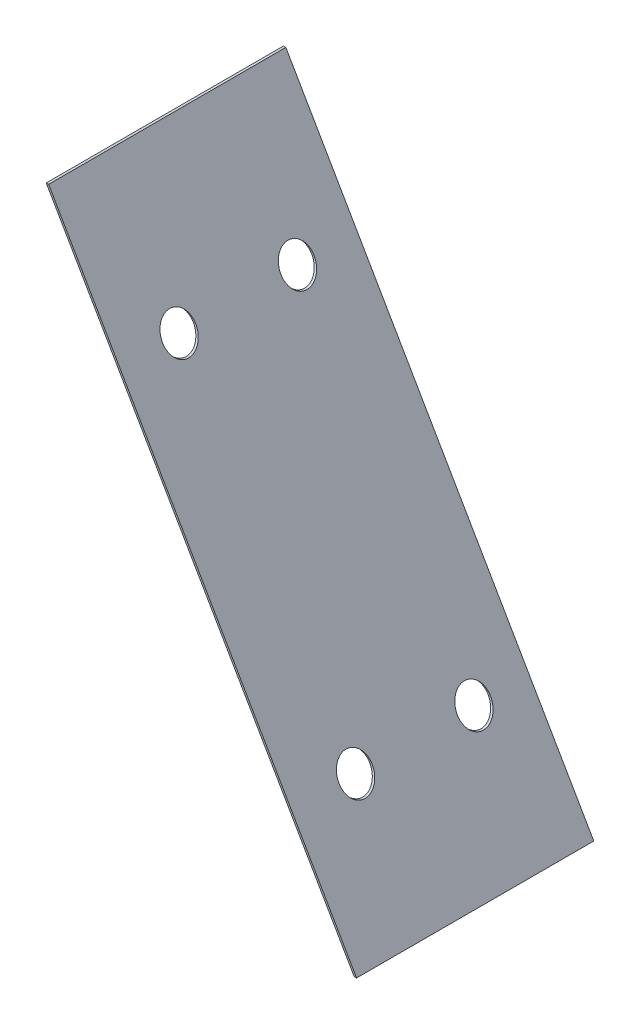
ISO-10303-21;
HEADER;
FILE_DESCRIPTION(('STEP AP214'),'2;1');
FILE_NAME('part.step','',(''),(''),'','','');
FILE_SCHEMA(('AUTOMOTIVE_DESIGN { 1 0 10303 214 1 1 1 1 }'));
ENDSEC;
DATA;
#1=APPLICATION_CONTEXT('core data for automotive mechanical design processes');
#2=APPLICATION_PROTOCOL_DEFINITION('international standard','automotive_design',2000,#1);
#3=PRODUCT_CONTEXT('',#1,'mechanical');
#4=PRODUCT('Part','Part','',(#3));
#5=PRODUCT_RELATED_PRODUCT_CATEGORY('part','',(#4));
#6=PRODUCT_DEFINITION_FORMATION('','',#4);
#7=PRODUCT_DEFINITION_CONTEXT('part definition',#1,'design');
#8=PRODUCT_DEFINITION('design','',#6,#7);
#9=PRODUCT_DEFINITION_SHAPE('','',#8);
#10=(LENGTH_UNIT() NAMED_UNIT(*) SI_UNIT(.MILLI.,.METRE.));
#11=(NAMED_UNIT(*) PLANE_ANGLE_UNIT() SI_UNIT($,.RADIAN.));
#12=(NAMED_UNIT(*) SI_UNIT($,.STERADIAN.) SOLID_ANGLE_UNIT());
#13=UNCERTAINTY_MEASURE_WITH_UNIT(LENGTH_MEASURE(1.E-05),#10,'distance_accuracy_value','');
#14=(GEOMETRIC_REPRESENTATION_CONTEXT(3) GLOBAL_UNCERTAINTY_ASSIGNED_CONTEXT((#13)) GLOBAL_UNIT_ASSIGNED_CONTEXT((#10,
#11,#12)) REPRESENTATION_CONTEXT('',''));
#15=CARTESIAN_POINT('',(0.,0.,0.));
#16=DIRECTION('',(0.,0.,1.));
#17=DIRECTION('',(1.,0.,0.));
#18=AXIS2_PLACEMENT_3D('',#15,#16,#17);
#19=CARTESIAN_POINT('',(32.5189335935961,-56.3244451920661,-90.2152556110115));
#20=DIRECTION('',(-0.866025403784436,-0.500000000000005,0.));
#21=DIRECTION('',(0.500000000000005,-0.866025403784436,0.));
#22=AXIS2_PLACEMENT_3D('',#19,#20,#21);
#23=PLANE('',#22);
#24=CARTESIAN_POINT('',(25.6628991469693,-44.4494451920663,-19.25));
#25=DIRECTION('',(-0.866025403784436,-0.500000000000005,0.));
#26=DIRECTION('',(0.500000000000005,-0.866025403784436,0.));
#27=AXIS2_PLACEMENT_3D('',#24,#25,#26);
#28=ELLIPSE('',#27,2.0207259421637,1.75);
#29=CARTESIAN_POINT('',(26.6732621180512,-46.1994451920663,-19.25));
#30=VERTEX_POINT('',#29);
#31=EDGE_CURVE('E116',#30,#30,#28,.T.);
#32=ORIENTED_EDGE('',*,*,#31,.F.);
#33=EDGE_LOOP('',(#32));
#34=FACE_BOUND('',#33,.T.);
#35=CARTESIAN_POINT('',(25.6628991469693,-44.4494451920663,-6.74999999999997));
#36=DIRECTION('',(-0.866025403784436,-0.500000000000005,0.));
#37=DIRECTION('',(0.500000000000005,-0.866025403784436,0.));
#38=AXIS2_PLACEMENT_3D('',#35,#36,#37);
#39=ELLIPSE('',#38,2.0207259421637,1.75);
#40=CARTESIAN_POINT('',(26.6732621180512,-46.1994451920663,-6.74999999999997));
#41=VERTEX_POINT('',#40);
#42=EDGE_CURVE('E113',#41,#41,#39,.T.);
#43=ORIENTED_EDGE('',*,*,#42,.F.);
#44=EDGE_LOOP('',(#43));
#45=FACE_BOUND('',#44,.T.);
#46=CARTESIAN_POINT('',(7.50555349946524,-13.,-6.27499999999999));
#47=DIRECTION('',(-0.866025403784436,-0.500000000000005,0.));
#48=DIRECTION('',(-0.500000000000005,0.866025403784436,0.));
#49=AXIS2_PLACEMENT_3D('',#46,#47,#48);
#50=ELLIPSE('',#49,2.0207259421637,1.75);
#51=CARTESIAN_POINT('',(6.49519052838338,-11.25,-6.27499999999999));
#52=VERTEX_POINT('',#51);
#53=EDGE_CURVE('E110',#52,#52,#50,.T.);
#54=ORIENTED_EDGE('',*,*,#53,.F.);
#55=EDGE_LOOP('',(#54));
#56=FACE_BOUND('',#55,.T.);
#57=CARTESIAN_POINT('',(7.50555349946525,-13.,-18.775));
#58=DIRECTION('',(-0.866025403784436,-0.500000000000005,0.));
#59=DIRECTION('',(-0.500000000000005,0.866025403784436,0.));
#60=AXIS2_PLACEMENT_3D('',#57,#58,#59);
#61=ELLIPSE('',#60,2.0207259421637,1.75);
#62=CARTESIAN_POINT('',(6.49519052838339,-11.25,-18.775));
#63=VERTEX_POINT('',#62);
#64=EDGE_CURVE('E92',#63,#63,#61,.T.);
#65=ORIENTED_EDGE('',*,*,#64,.F.);
#66=EDGE_LOOP('',(#65));
#67=FACE_BOUND('',#66,.T.);
#68=DIRECTION('',(-0.500000000000005,0.866025403784436,0.));
#69=VECTOR('',#68,1.);
#70=CARTESIAN_POINT('',(32.5189335935961,-56.3244451920661,-25.05));
#71=LINE('',#70,#69);
#72=CARTESIAN_POINT('',(32.5189335935961,-56.3244451920661,-25.05));
#73=VERTEX_POINT('',#72);
#74=CARTESIAN_POINT('',(0.,0.,-25.05));
#75=VERTEX_POINT('',#74);
#76=EDGE_CURVE('E41',#73,#75,#71,.T.);
#77=ORIENTED_EDGE('',*,*,#76,.F.);
#78=DIRECTION('',(0.,0.,1.));
#79=VECTOR('',#78,1.);
#80=CARTESIAN_POINT('',(32.5189335935961,-56.3244451920661,-90.2152556110115));
#81=LINE('',#80,#79);
#82=CARTESIAN_POINT('',(32.5189335935961,-56.3244451920661,0.));
#83=VERTEX_POINT('',#82);
#84=EDGE_CURVE('E70',#73,#83,#81,.T.);
#85=ORIENTED_EDGE('',*,*,#84,.T.);
#86=DIRECTION('',(0.500000000000005,-0.866025403784436,0.));
#87=VECTOR('',#86,1.);
#88=CARTESIAN_POINT('',(32.5189335935961,-56.3244451920661,0.));
#89=LINE('',#88,#87);
#90=CARTESIAN_POINT('',(0.,0.,0.));
#91=VERTEX_POINT('',#90);
#92=EDGE_CURVE('E74',#91,#83,#89,.T.);
#93=ORIENTED_EDGE('',*,*,#92,.F.);
#94=DIRECTION('',(0.,0.,1.));
#95=VECTOR('',#94,1.);
#96=CARTESIAN_POINT('',(0.,0.,-90.2152556110115));
#97=LINE('',#96,#95);
#98=EDGE_CURVE('E102',#75,#91,#97,.T.);
#99=ORIENTED_EDGE('',*,*,#98,.F.);
#100=EDGE_LOOP('',(#77,#85,#93,#99));
#101=FACE_BOUND('',#100,.T.);
#102=ADVANCED_FACE('F32',(#34,#45,#56,#67,#101),#23,.T.);
#103=CARTESIAN_POINT('',(0.,0.,-90.2152556110115));
#104=DIRECTION('',(0.,1.,0.));
#105=DIRECTION('',(-1.,0.,0.));
#106=AXIS2_PLACEMENT_3D('',#103,#104,#105);
#107=PLANE('',#106);
#108=DIRECTION('',(1.,0.,0.));
#109=VECTOR('',#108,1.);
#110=CARTESIAN_POINT('',(0.,0.,-25.05));
#111=LINE('',#110,#109);
#112=CARTESIAN_POINT('',(0.254034118443439,0.,-25.05));
#113=VERTEX_POINT('',#112);
#114=EDGE_CURVE('E48',#75,#113,#111,.T.);
#115=ORIENTED_EDGE('',*,*,#114,.F.);
#116=ORIENTED_EDGE('',*,*,#98,.T.);
#117=DIRECTION('',(-1.,0.,0.));
#118=VECTOR('',#117,1.);
#119=CARTESIAN_POINT('',(0.,0.,0.));
#120=LINE('',#119,#118);
#121=CARTESIAN_POINT('',(0.254034118443439,0.,0.));
#122=VERTEX_POINT('',#121);
#123=EDGE_CURVE('E79',#122,#91,#120,.T.);
#124=ORIENTED_EDGE('',*,*,#123,.F.);
#125=DIRECTION('',(0.,0.,1.));
#126=VECTOR('',#125,1.);
#127=CARTESIAN_POINT('',(0.254034118443439,0.,-90.2152556110115));
#128=LINE('',#127,#126);
#129=EDGE_CURVE('E105',#113,#122,#128,.T.);
#130=ORIENTED_EDGE('',*,*,#129,.F.);
#131=EDGE_LOOP('',(#115,#116,#124,#130));
#132=FACE_BOUND('',#131,.T.);
#133=ADVANCED_FACE('F132',(#132),#107,.T.);
#134=CARTESIAN_POINT('',(0.254034118443439,0.,-90.2152556110115));
#135=DIRECTION('',(0.866025403784437,0.500000000000003,0.));
#136=DIRECTION('',(-0.500000000000003,0.866025403784437,0.));
#137=AXIS2_PLACEMENT_3D('',#134,#135,#136);
#138=PLANE('',#137);
#139=CARTESIAN_POINT('',(25.9169332654127,-44.4494451920663,-19.25));
#140=DIRECTION('',(0.866025403784437,0.500000000000003,0.));
#141=DIRECTION('',(0.500000000000003,-0.866025403784437,0.));
#142=AXIS2_PLACEMENT_3D('',#139,#140,#141);
#143=ELLIPSE('',#142,2.0207259421637,1.75);
#144=CARTESIAN_POINT('',(26.9272962364945,-46.1994451920663,-19.25));
#145=VERTEX_POINT('',#144);
#146=EDGE_CURVE('E35',#145,#145,#143,.T.);
#147=ORIENTED_EDGE('',*,*,#146,.F.);
#148=EDGE_LOOP('',(#147));
#149=FACE_BOUND('',#148,.T.);
#150=CARTESIAN_POINT('',(25.9169332654127,-44.4494451920663,-6.74999999999997));
#151=DIRECTION('',(0.866025403784437,0.500000000000003,0.));
#152=DIRECTION('',(0.500000000000003,-0.866025403784437,0.));
#153=AXIS2_PLACEMENT_3D('',#150,#151,#152);
#154=ELLIPSE('',#153,2.0207259421637,1.75);
#155=CARTESIAN_POINT('',(26.9272962364945,-46.1994451920663,-6.74999999999997));
#156=VERTEX_POINT('',#155);
#157=EDGE_CURVE('E114',#156,#156,#154,.T.);
#158=ORIENTED_EDGE('',*,*,#157,.F.);
#159=EDGE_LOOP('',(#158));
#160=FACE_BOUND('',#159,.T.);
#161=CARTESIAN_POINT('',(7.75958761790864,-13.,-6.27499999999999));
#162=DIRECTION('',(0.866025403784437,0.500000000000003,0.));
#163=DIRECTION('',(-0.500000000000003,0.866025403784437,0.));
#164=AXIS2_PLACEMENT_3D('',#161,#162,#163);
#165=ELLIPSE('',#164,2.0207259421637,1.75);
#166=CARTESIAN_POINT('',(6.74922464682678,-11.25,-6.27499999999999));
#167=VERTEX_POINT('',#166);
#168=EDGE_CURVE('E111',#167,#167,#165,.T.);
#169=ORIENTED_EDGE('',*,*,#168,.F.);
#170=EDGE_LOOP('',(#169));
#171=FACE_BOUND('',#170,.T.);
#172=CARTESIAN_POINT('',(7.75958761790864,-13.,-18.775));
#173=DIRECTION('',(0.866025403784437,0.500000000000003,0.));
#174=DIRECTION('',(-0.500000000000003,0.866025403784437,0.));
#175=AXIS2_PLACEMENT_3D('',#172,#173,#174);
#176=ELLIPSE('',#175,2.0207259421637,1.75);
#177=CARTESIAN_POINT('',(6.74922464682678,-11.25,-18.775));
#178=VERTEX_POINT('',#177);
#179=EDGE_CURVE('E95',#178,#178,#176,.T.);
#180=ORIENTED_EDGE('',*,*,#179,.F.);
#181=EDGE_LOOP('',(#180));
#182=FACE_BOUND('',#181,.T.);
#183=DIRECTION('',(0.500000000000003,-0.866025403784437,0.));
#184=VECTOR('',#183,1.);
#185=CARTESIAN_POINT('',(0.254034118443422,0.,-25.05));
#186=LINE('',#185,#184);
#187=CARTESIAN_POINT('',(32.7729677120395,-56.3244451920663,-25.05));
#188=VERTEX_POINT('',#187);
#189=EDGE_CURVE('E104',#113,#188,#186,.T.);
#190=ORIENTED_EDGE('',*,*,#189,.F.);
#191=ORIENTED_EDGE('',*,*,#129,.T.);
#192=DIRECTION('',(-0.500000000000003,0.866025403784437,0.));
#193=VECTOR('',#192,1.);
#194=CARTESIAN_POINT('',(0.254034118443439,0.,0.));
#195=LINE('',#194,#193);
#196=CARTESIAN_POINT('',(32.7729677120395,-56.3244451920663,0.));
#197=VERTEX_POINT('',#196);
#198=EDGE_CURVE('E88',#197,#122,#195,.T.);
#199=ORIENTED_EDGE('',*,*,#198,.F.);
#200=DIRECTION('',(0.,0.,1.));
#201=VECTOR('',#200,1.);
#202=CARTESIAN_POINT('',(32.7729677120395,-56.3244451920663,-90.2152556110115));
#203=LINE('',#202,#201);
#204=EDGE_CURVE('E78',#188,#197,#203,.T.);
#205=ORIENTED_EDGE('',*,*,#204,.F.);
#206=EDGE_LOOP('',(#190,#191,#199,#205));
#207=FACE_BOUND('',#206,.T.);
#208=ADVANCED_FACE('F134',(#149,#160,#171,#182,#207),#138,.T.);
#209=CARTESIAN_POINT('',(32.7729677120395,-56.3244451920663,-90.2152556110115));
#210=DIRECTION('',(-7.10185083039538E-13,-1.,0.));
#211=DIRECTION('',(1.,-7.10185083039538E-13,0.));
#212=AXIS2_PLACEMENT_3D('',#209,#210,#211);
#213=PLANE('',#212);
#214=DIRECTION('',(-1.,7.10185083039538E-13,0.));
#215=VECTOR('',#214,1.);
#216=CARTESIAN_POINT('',(32.7729677120395,-56.3244451920663,-25.05));
#217=LINE('',#216,#215);
#218=EDGE_CURVE('E11',#188,#73,#217,.T.);
#219=ORIENTED_EDGE('',*,*,#218,.F.);
#220=ORIENTED_EDGE('',*,*,#204,.T.);
#221=DIRECTION('',(1.,-7.10185083039538E-13,0.));
#222=VECTOR('',#221,1.);
#223=CARTESIAN_POINT('',(32.7729677120395,-56.3244451920663,0.));
#224=LINE('',#223,#222);
#225=EDGE_CURVE('E82',#83,#197,#224,.T.);
#226=ORIENTED_EDGE('',*,*,#225,.F.);
#227=ORIENTED_EDGE('',*,*,#84,.F.);
#228=EDGE_LOOP('',(#219,#220,#226,#227));
#229=FACE_BOUND('',#228,.T.);
#230=ADVANCED_FACE('F83',(#229),#213,.T.);
#231=CARTESIAN_POINT('',(0.,0.,0.));
#232=DIRECTION('',(0.,0.,-1.));
#233=DIRECTION('',(-1.,0.,0.));
#234=AXIS2_PLACEMENT_3D('',#231,#232,#233);
#235=PLANE('',#234);
#236=ORIENTED_EDGE('',*,*,#92,.T.);
#237=ORIENTED_EDGE('',*,*,#225,.T.);
#238=ORIENTED_EDGE('',*,*,#198,.T.);
#239=ORIENTED_EDGE('',*,*,#123,.T.);
#240=EDGE_LOOP('',(#236,#237,#238,#239));
#241=FACE_BOUND('',#240,.T.);
#242=ADVANCED_FACE('F90',(#241),#235,.F.);
#243=CARTESIAN_POINT('',(0.,0.,-25.05));
#244=DIRECTION('',(0.,0.,1.));
#245=DIRECTION('',(1.,0.,0.));
#246=AXIS2_PLACEMENT_3D('',#243,#244,#245);
#247=PLANE('',#246);
#248=ORIENTED_EDGE('',*,*,#76,.T.);
#249=ORIENTED_EDGE('',*,*,#114,.T.);
#250=ORIENTED_EDGE('',*,*,#189,.T.);
#251=ORIENTED_EDGE('',*,*,#218,.T.);
#252=EDGE_LOOP('',(#248,#249,#250,#251));
#253=FACE_BOUND('',#252,.T.);
#254=ADVANCED_FACE('F129',(#253),#247,.F.);
#255=CARTESIAN_POINT('',(32.7729677120395,-13.,-18.775));
#256=DIRECTION('',(-1.,0.,0.));
#257=DIRECTION('',(0.,0.,1.));
#258=AXIS2_PLACEMENT_3D('',#255,#256,#257);
#259=CYLINDRICAL_SURFACE('',#258,1.75);
#260=ORIENTED_EDGE('',*,*,#64,.T.);
#261=EDGE_LOOP('',(#260));
#262=FACE_BOUND('',#261,.T.);
#263=ORIENTED_EDGE('',*,*,#179,.T.);
#264=EDGE_LOOP('',(#263));
#265=FACE_BOUND('',#264,.T.);
#266=ADVANCED_FACE('F156',(#262,#265),#259,.F.);
#267=CARTESIAN_POINT('',(32.7729677120395,-13.,-6.275));
#268=DIRECTION('',(-1.,0.,0.));
#269=DIRECTION('',(0.,0.,1.));
#270=AXIS2_PLACEMENT_3D('',#267,#268,#269);
#271=CYLINDRICAL_SURFACE('',#270,1.75);
#272=ORIENTED_EDGE('',*,*,#53,.T.);
#273=EDGE_LOOP('',(#272));
#274=FACE_BOUND('',#273,.T.);
#275=ORIENTED_EDGE('',*,*,#168,.T.);
#276=EDGE_LOOP('',(#275));
#277=FACE_BOUND('',#276,.T.);
#278=ADVANCED_FACE('F159',(#274,#277),#271,.F.);
#279=CARTESIAN_POINT('',(0.,-44.4494451920663,-6.74999999999997));
#280=DIRECTION('',(1.,0.,0.));
#281=DIRECTION('',(0.,1.,0.));
#282=AXIS2_PLACEMENT_3D('',#279,#280,#281);
#283=CYLINDRICAL_SURFACE('',#282,1.75);
#284=ORIENTED_EDGE('',*,*,#42,.T.);
#285=EDGE_LOOP('',(#284));
#286=FACE_BOUND('',#285,.T.);
#287=ORIENTED_EDGE('',*,*,#157,.T.);
#288=EDGE_LOOP('',(#287));
#289=FACE_BOUND('',#288,.T.);
#290=ADVANCED_FACE('F167',(#286,#289),#283,.F.);
#291=CARTESIAN_POINT('',(0.,-44.4494451920663,-19.25));
#292=DIRECTION('',(1.,0.,0.));
#293=DIRECTION('',(0.,1.,0.));
#294=AXIS2_PLACEMENT_3D('',#291,#292,#293);
#295=CYLINDRICAL_SURFACE('',#294,1.75);
#296=ORIENTED_EDGE('',*,*,#31,.T.);
#297=EDGE_LOOP('',(#296));
#298=FACE_BOUND('',#297,.T.);
#299=ORIENTED_EDGE('',*,*,#146,.T.);
#300=EDGE_LOOP('',(#299));
#301=FACE_BOUND('',#300,.T.);
#302=ADVANCED_FACE('F211',(#298,#301),#295,.F.);
#303=CLOSED_SHELL('',(#102,#133,#208,#230,#242,#254,#266,#278,#290,#302));
#304=MANIFOLD_SOLID_BREP('B2',#303);
#305=ADVANCED_BREP_SHAPE_REPRESENTATION('',(#18,#304),#14);
#306=SHAPE_DEFINITION_REPRESENTATION(#9,#305);
ENDSEC;
END-ISO-10303-21;
